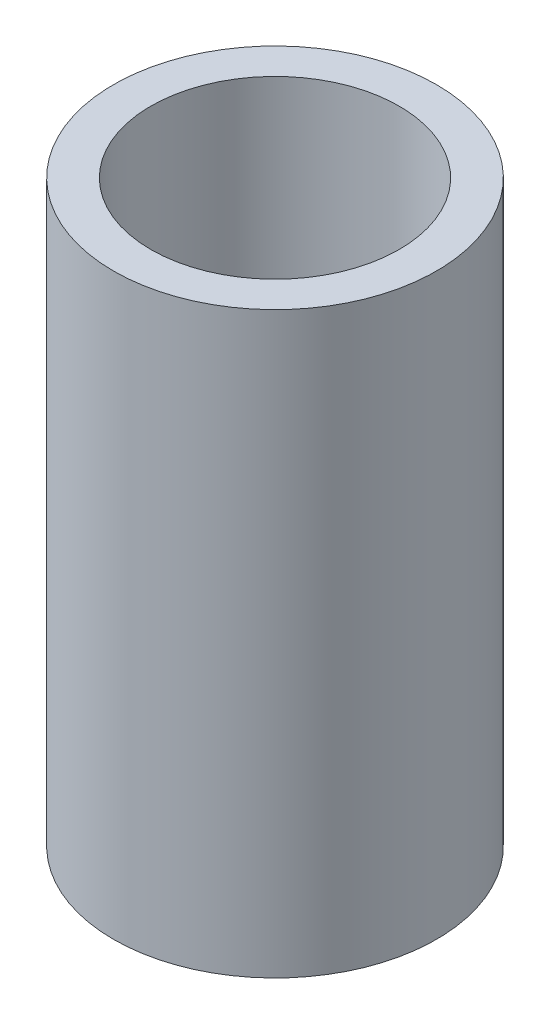
ISO-10303-21;
HEADER;
FILE_DESCRIPTION(('STEP AP214'),'2;1');
FILE_NAME('part.step','',(''),(''),'','','');
FILE_SCHEMA(('AUTOMOTIVE_DESIGN { 1 0 10303 214 1 1 1 1 }'));
ENDSEC;
DATA;
#1=APPLICATION_CONTEXT('core data for automotive mechanical design processes');
#2=APPLICATION_PROTOCOL_DEFINITION('international standard','automotive_design',2000,#1);
#3=PRODUCT_CONTEXT('',#1,'mechanical');
#4=PRODUCT('Part','Part','',(#3));
#5=PRODUCT_RELATED_PRODUCT_CATEGORY('part','',(#4));
#6=PRODUCT_DEFINITION_FORMATION('','',#4);
#7=PRODUCT_DEFINITION_CONTEXT('part definition',#1,'design');
#8=PRODUCT_DEFINITION('design','',#6,#7);
#9=PRODUCT_DEFINITION_SHAPE('','',#8);
#10=(LENGTH_UNIT() NAMED_UNIT(*) SI_UNIT(.MILLI.,.METRE.));
#11=(NAMED_UNIT(*) PLANE_ANGLE_UNIT() SI_UNIT($,.RADIAN.));
#12=(NAMED_UNIT(*) SI_UNIT($,.STERADIAN.) SOLID_ANGLE_UNIT());
#13=UNCERTAINTY_MEASURE_WITH_UNIT(LENGTH_MEASURE(1.E-05),#10,'distance_accuracy_value','');
#14=(GEOMETRIC_REPRESENTATION_CONTEXT(3) GLOBAL_UNCERTAINTY_ASSIGNED_CONTEXT((#13)) GLOBAL_UNIT_ASSIGNED_CONTEXT((#10,
#11,#12)) REPRESENTATION_CONTEXT('',''));
#15=CARTESIAN_POINT('',(0.,0.,0.));
#16=DIRECTION('',(0.,0.,1.));
#17=DIRECTION('',(1.,0.,0.));
#18=AXIS2_PLACEMENT_3D('',#15,#16,#17);
#19=CARTESIAN_POINT('',(0.,23.3,0.));
#20=DIRECTION('',(0.,1.,0.));
#21=DIRECTION('',(0.,0.,1.));
#22=AXIS2_PLACEMENT_3D('',#19,#20,#21);
#23=PLANE('',#22);
#24=CARTESIAN_POINT('',(0.,23.3,0.));
#25=DIRECTION('',(0.,1.,0.));
#26=DIRECTION('',(0.,0.,1.));
#27=AXIS2_PLACEMENT_3D('',#24,#25,#26);
#28=CIRCLE('',#27,6.5);
#29=CARTESIAN_POINT('',(0.,23.3,6.5));
#30=VERTEX_POINT('',#29);
#31=EDGE_CURVE('E10',#30,#30,#28,.T.);
#32=ORIENTED_EDGE('',*,*,#31,.T.);
#33=EDGE_LOOP('',(#32));
#34=FACE_BOUND('',#33,.T.);
#35=CARTESIAN_POINT('',(0.,23.3,0.));
#36=DIRECTION('',(0.,1.,0.));
#37=DIRECTION('',(0.,0.,1.));
#38=AXIS2_PLACEMENT_3D('',#35,#36,#37);
#39=CIRCLE('',#38,5.);
#40=CARTESIAN_POINT('',(0.,23.3,5.));
#41=VERTEX_POINT('',#40);
#42=EDGE_CURVE('E42',#41,#41,#39,.T.);
#43=ORIENTED_EDGE('',*,*,#42,.F.);
#44=EDGE_LOOP('',(#43));
#45=FACE_BOUND('',#44,.T.);
#46=ADVANCED_FACE('F31',(#34,#45),#23,.T.);
#47=CARTESIAN_POINT('',(0.,0.,0.));
#48=DIRECTION('',(0.,1.,0.));
#49=DIRECTION('',(0.,0.,1.));
#50=AXIS2_PLACEMENT_3D('',#47,#48,#49);
#51=PLANE('',#50);
#52=CARTESIAN_POINT('',(0.,0.,0.));
#53=DIRECTION('',(0.,1.,0.));
#54=DIRECTION('',(0.,0.,1.));
#55=AXIS2_PLACEMENT_3D('',#52,#53,#54);
#56=CIRCLE('',#55,6.5);
#57=CARTESIAN_POINT('',(0.,0.,6.5));
#58=VERTEX_POINT('',#57);
#59=EDGE_CURVE('E35',#58,#58,#56,.T.);
#60=ORIENTED_EDGE('',*,*,#59,.F.);
#61=EDGE_LOOP('',(#60));
#62=FACE_BOUND('',#61,.T.);
#63=CARTESIAN_POINT('',(0.,0.,0.));
#64=DIRECTION('',(0.,1.,0.));
#65=DIRECTION('',(0.,0.,1.));
#66=AXIS2_PLACEMENT_3D('',#63,#64,#65);
#67=CIRCLE('',#66,5.);
#68=CARTESIAN_POINT('',(0.,0.,5.));
#69=VERTEX_POINT('',#68);
#70=EDGE_CURVE('E44',#69,#69,#67,.T.);
#71=ORIENTED_EDGE('',*,*,#70,.T.);
#72=EDGE_LOOP('',(#71));
#73=FACE_BOUND('',#72,.T.);
#74=ADVANCED_FACE('F54',(#62,#73),#51,.F.);
#75=CARTESIAN_POINT('',(0.,23.3,0.));
#76=DIRECTION('',(0.,-1.,0.));
#77=DIRECTION('',(0.,0.,-1.));
#78=AXIS2_PLACEMENT_3D('',#75,#76,#77);
#79=CYLINDRICAL_SURFACE('',#78,6.5);
#80=ORIENTED_EDGE('',*,*,#31,.F.);
#81=EDGE_LOOP('',(#80));
#82=FACE_BOUND('',#81,.T.);
#83=ORIENTED_EDGE('',*,*,#59,.T.);
#84=EDGE_LOOP('',(#83));
#85=FACE_BOUND('',#84,.T.);
#86=ADVANCED_FACE('F33',(#82,#85),#79,.T.);
#87=CARTESIAN_POINT('',(0.,23.3,0.));
#88=DIRECTION('',(0.,-1.,0.));
#89=DIRECTION('',(0.,0.,-1.));
#90=AXIS2_PLACEMENT_3D('',#87,#88,#89);
#91=CYLINDRICAL_SURFACE('',#90,5.);
#92=ORIENTED_EDGE('',*,*,#42,.T.);
#93=EDGE_LOOP('',(#92));
#94=FACE_BOUND('',#93,.T.);
#95=ORIENTED_EDGE('',*,*,#70,.F.);
#96=EDGE_LOOP('',(#95));
#97=FACE_BOUND('',#96,.T.);
#98=ADVANCED_FACE('F50',(#94,#97),#91,.F.);
#99=CLOSED_SHELL('',(#46,#74,#86,#98));
#100=MANIFOLD_SOLID_BREP('B2',#99);
#101=ADVANCED_BREP_SHAPE_REPRESENTATION('',(#18,#100),#14);
#102=SHAPE_DEFINITION_REPRESENTATION(#9,#101);
ENDSEC;
END-ISO-10303-21;
